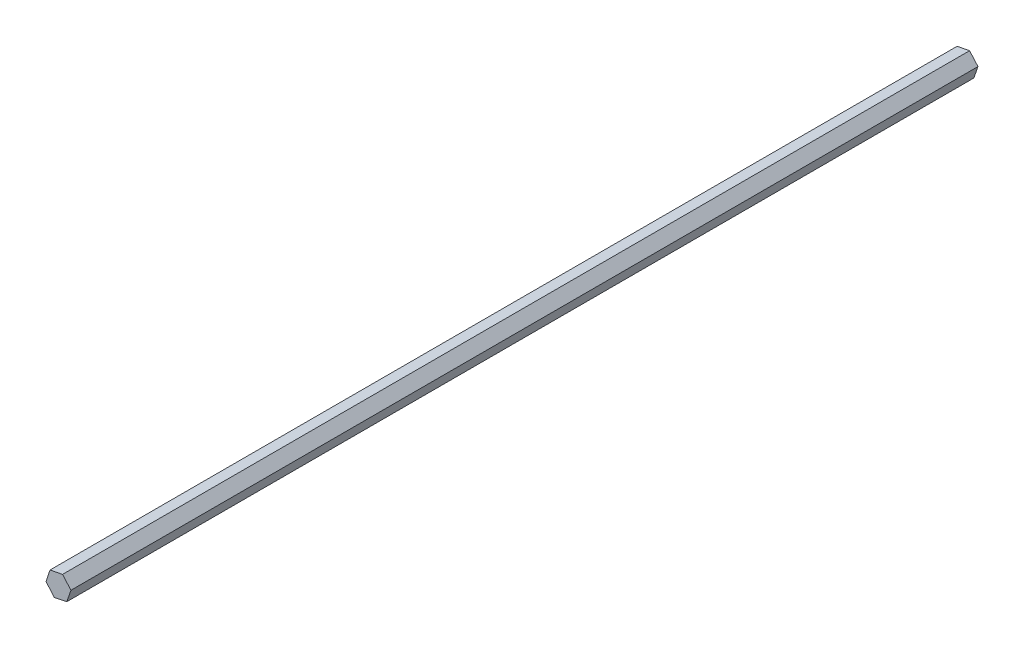
ISO-10303-21;
HEADER;
FILE_DESCRIPTION(('STEP AP214'),'2;1');
FILE_NAME('part.step','',(''),(''),'','','');
FILE_SCHEMA(('AUTOMOTIVE_DESIGN { 1 0 10303 214 1 1 1 1 }'));
ENDSEC;
DATA;
#1=APPLICATION_CONTEXT('core data for automotive mechanical design processes');
#2=APPLICATION_PROTOCOL_DEFINITION('international standard','automotive_design',2000,#1);
#3=PRODUCT_CONTEXT('',#1,'mechanical');
#4=PRODUCT('Part','Part','',(#3));
#5=PRODUCT_RELATED_PRODUCT_CATEGORY('part','',(#4));
#6=PRODUCT_DEFINITION_FORMATION('','',#4);
#7=PRODUCT_DEFINITION_CONTEXT('part definition',#1,'design');
#8=PRODUCT_DEFINITION('design','',#6,#7);
#9=PRODUCT_DEFINITION_SHAPE('','',#8);
#10=(LENGTH_UNIT() NAMED_UNIT(*) SI_UNIT(.MILLI.,.METRE.));
#11=(NAMED_UNIT(*) PLANE_ANGLE_UNIT() SI_UNIT($,.RADIAN.));
#12=(NAMED_UNIT(*) SI_UNIT($,.STERADIAN.) SOLID_ANGLE_UNIT());
#13=UNCERTAINTY_MEASURE_WITH_UNIT(LENGTH_MEASURE(1.E-05),#10,'distance_accuracy_value','');
#14=(GEOMETRIC_REPRESENTATION_CONTEXT(3) GLOBAL_UNCERTAINTY_ASSIGNED_CONTEXT((#13)) GLOBAL_UNIT_ASSIGNED_CONTEXT((#10,
#11,#12)) REPRESENTATION_CONTEXT('',''));
#15=CARTESIAN_POINT('',(0.,0.,0.));
#16=DIRECTION('',(0.,0.,1.));
#17=DIRECTION('',(1.,0.,0.));
#18=AXIS2_PLACEMENT_3D('',#15,#16,#17);
#19=CARTESIAN_POINT('',(-6.01957165055815,2.02169660033267,294.64));
#20=DIRECTION('',(-0.947964039457976,0.318377417375223,0.));
#21=DIRECTION('',(-0.318377417375223,-0.947964039457976,0.));
#22=AXIS2_PLACEMENT_3D('',#19,#20,#21);
#23=PLANE('',#22);
#24=DIRECTION('',(0.318377417375223,0.947964039457976,0.));
#25=VECTOR('',#24,1.);
#26=CARTESIAN_POINT('',(-6.01957165055815,2.02169660033267,-228.6));
#27=LINE('',#26,#25);
#28=CARTESIAN_POINT('',(-7.17571857524597,-1.42071372502755,-228.6));
#29=VERTEX_POINT('',#28);
#30=CARTESIAN_POINT('',(-4.84121158124874,5.53024623443575,-228.6));
#31=VERTEX_POINT('',#30);
#32=EDGE_CURVE('E119',#29,#31,#27,.T.);
#33=ORIENTED_EDGE('',*,*,#32,.F.);
#34=DIRECTION('',(0.,0.,-1.));
#35=VECTOR('',#34,1.);
#36=CARTESIAN_POINT('',(-7.17571857524597,-1.42071372502755,294.64));
#37=LINE('',#36,#35);
#38=CARTESIAN_POINT('',(-7.17571857524597,-1.42071372502755,294.64));
#39=VERTEX_POINT('',#38);
#40=EDGE_CURVE('E11',#39,#29,#37,.T.);
#41=ORIENTED_EDGE('',*,*,#40,.F.);
#42=DIRECTION('',(0.318377417375223,0.947964039457976,0.));
#43=VECTOR('',#42,1.);
#44=CARTESIAN_POINT('',(-6.01957165055815,2.02169660033267,294.64));
#45=LINE('',#44,#43);
#46=CARTESIAN_POINT('',(-4.84121158124874,5.53024623443575,294.64));
#47=VERTEX_POINT('',#46);
#48=EDGE_CURVE('E133',#39,#47,#45,.T.);
#49=ORIENTED_EDGE('',*,*,#48,.T.);
#50=DIRECTION('',(0.,0.,-1.));
#51=VECTOR('',#50,1.);
#52=CARTESIAN_POINT('',(-4.84121158124874,5.53024623443575,294.64));
#53=LINE('',#52,#51);
#54=EDGE_CURVE('E37',#47,#31,#53,.T.);
#55=ORIENTED_EDGE('',*,*,#54,.T.);
#56=EDGE_LOOP('',(#33,#41,#49,#55));
#57=FACE_BOUND('',#56,.T.);
#58=ADVANCED_FACE('F34',(#57),#23,.T.);
#59=CARTESIAN_POINT('',(-4.79509283412342,-4.16288177974564,294.64));
#60=DIRECTION('',(-0.755132729783216,-0.655571933818211,0.));
#61=DIRECTION('',(0.655571933818211,-0.755132729783216,0.));
#62=AXIS2_PLACEMENT_3D('',#59,#60,#61);
#63=PLANE('',#62);
#64=DIRECTION('',(-0.655571933818211,0.755132729783216,0.));
#65=VECTOR('',#64,1.);
#66=CARTESIAN_POINT('',(-4.79509283412342,-4.16288177974564,-228.6));
#67=LINE('',#66,#65);
#68=CARTESIAN_POINT('',(-2.36872793758021,-6.95773533167472,-228.6));
#69=VERTEX_POINT('',#68);
#70=EDGE_CURVE('E131',#69,#29,#67,.T.);
#71=ORIENTED_EDGE('',*,*,#70,.F.);
#72=DIRECTION('',(0.,0.,-1.));
#73=VECTOR('',#72,1.);
#74=CARTESIAN_POINT('',(-2.36872793758021,-6.95773533167472,294.64));
#75=LINE('',#74,#73);
#76=CARTESIAN_POINT('',(-2.36872793758021,-6.95773533167472,294.64));
#77=VERTEX_POINT('',#76);
#78=EDGE_CURVE('E43',#77,#69,#75,.T.);
#79=ORIENTED_EDGE('',*,*,#78,.F.);
#80=DIRECTION('',(-0.655571933818211,0.755132729783216,0.));
#81=VECTOR('',#80,1.);
#82=CARTESIAN_POINT('',(-4.79509283412342,-4.16288177974564,294.64));
#83=LINE('',#82,#81);
#84=EDGE_CURVE('E109',#77,#39,#83,.T.);
#85=ORIENTED_EDGE('',*,*,#84,.T.);
#86=ORIENTED_EDGE('',*,*,#40,.T.);
#87=EDGE_LOOP('',(#71,#79,#85,#86));
#88=FACE_BOUND('',#87,.T.);
#89=ADVANCED_FACE('F141',(#88),#63,.T.);
#90=CARTESIAN_POINT('',(1.25894521064635,-6.22395026945031,294.64));
#91=DIRECTION('',(0.198259088290764,-0.980149648732333,0.));
#92=DIRECTION('',(0.980149648732333,0.198259088290764,0.));
#93=AXIS2_PLACEMENT_3D('',#90,#91,#92);
#94=PLANE('',#93);
#95=DIRECTION('',(-0.980149648732333,-0.198259088290764,0.));
#96=VECTOR('',#95,1.);
#97=CARTESIAN_POINT('',(1.25894521064635,-6.22395026945031,-228.6));
#98=LINE('',#97,#96);
#99=CARTESIAN_POINT('',(4.81823346500206,-5.50399771405711,-228.6));
#100=VERTEX_POINT('',#99);
#101=EDGE_CURVE('E96',#100,#69,#98,.T.);
#102=ORIENTED_EDGE('',*,*,#101,.F.);
#103=DIRECTION('',(0.,0.,-1.));
#104=VECTOR('',#103,1.);
#105=CARTESIAN_POINT('',(4.81823346500206,-5.50399771405711,294.64));
#106=LINE('',#105,#104);
#107=CARTESIAN_POINT('',(4.81823346500206,-5.50399771405711,294.64));
#108=VERTEX_POINT('',#107);
#109=EDGE_CURVE('E91',#108,#100,#106,.T.);
#110=ORIENTED_EDGE('',*,*,#109,.F.);
#111=DIRECTION('',(-0.980149648732333,-0.198259088290764,0.));
#112=VECTOR('',#111,1.);
#113=CARTESIAN_POINT('',(1.25894521064635,-6.22395026945031,294.64));
#114=LINE('',#113,#112);
#115=EDGE_CURVE('E94',#108,#77,#114,.T.);
#116=ORIENTED_EDGE('',*,*,#115,.T.);
#117=ORIENTED_EDGE('',*,*,#78,.T.);
#118=EDGE_LOOP('',(#102,#110,#116,#117));
#119=FACE_BOUND('',#118,.T.);
#120=ADVANCED_FACE('F93',(#119),#94,.T.);
#121=CARTESIAN_POINT('',(6.00270779127281,-2.07123131798279,294.64));
#122=DIRECTION('',(0.945308313586269,-0.32617816031225,0.));
#123=DIRECTION('',(0.32617816031225,0.945308313586269,0.));
#124=AXIS2_PLACEMENT_3D('',#121,#122,#123);
#125=PLANE('',#124);
#126=DIRECTION('',(-0.32617816031225,-0.945308313586269,0.));
#127=VECTOR('',#126,1.);
#128=CARTESIAN_POINT('',(6.00270779127281,-2.07123131798279,-228.6));
#129=LINE('',#128,#127);
#130=CARTESIAN_POINT('',(7.20993951882896,1.42748909723898,-228.6));
#131=VERTEX_POINT('',#130);
#132=EDGE_CURVE('E128',#131,#100,#129,.T.);
#133=ORIENTED_EDGE('',*,*,#132,.F.);
#134=DIRECTION('',(0.,0.,-1.));
#135=VECTOR('',#134,1.);
#136=CARTESIAN_POINT('',(7.20993951882896,1.42748909723898,294.64));
#137=LINE('',#136,#135);
#138=CARTESIAN_POINT('',(7.20993951882896,1.42748909723898,294.64));
#139=VERTEX_POINT('',#138);
#140=EDGE_CURVE('E101',#139,#131,#137,.T.);
#141=ORIENTED_EDGE('',*,*,#140,.F.);
#142=DIRECTION('',(-0.32617816031225,-0.945308313586269,0.));
#143=VECTOR('',#142,1.);
#144=CARTESIAN_POINT('',(6.00270779127281,-2.07123131798279,294.64));
#145=LINE('',#144,#143);
#146=EDGE_CURVE('E107',#139,#108,#145,.T.);
#147=ORIENTED_EDGE('',*,*,#146,.T.);
#148=ORIENTED_EDGE('',*,*,#109,.T.);
#149=EDGE_LOOP('',(#133,#141,#147,#148));
#150=FACE_BOUND('',#149,.T.);
#151=ADVANCED_FACE('F111',(#150),#125,.T.);
#152=CARTESIAN_POINT('',(4.7606264399118,4.20225366911765,294.64));
#153=DIRECTION('',(0.749704951167212,0.66177223135711,0.));
#154=DIRECTION('',(-0.66177223135711,0.749704951167212,0.));
#155=AXIS2_PLACEMENT_3D('',#152,#153,#154);
#156=PLANE('',#155);
#157=DIRECTION('',(0.66177223135711,-0.749704951167212,0.));
#158=VECTOR('',#157,1.);
#159=CARTESIAN_POINT('',(4.7606264399118,4.20225366911765,-228.6));
#160=LINE('',#159,#158);
#161=CARTESIAN_POINT('',(2.35748511024392,6.92471143908466,-228.6));
#162=VERTEX_POINT('',#161);
#163=EDGE_CURVE('E125',#162,#131,#160,.T.);
#164=ORIENTED_EDGE('',*,*,#163,.F.);
#165=DIRECTION('',(0.,0.,-1.));
#166=VECTOR('',#165,1.);
#167=CARTESIAN_POINT('',(2.35748511024392,6.92471143908466,294.64));
#168=LINE('',#167,#166);
#169=CARTESIAN_POINT('',(2.35748511024392,6.92471143908466,294.64));
#170=VERTEX_POINT('',#169);
#171=EDGE_CURVE('E136',#170,#162,#168,.T.);
#172=ORIENTED_EDGE('',*,*,#171,.F.);
#173=DIRECTION('',(0.66177223135711,-0.749704951167212,0.));
#174=VECTOR('',#173,1.);
#175=CARTESIAN_POINT('',(4.7606264399118,4.20225366911765,294.64));
#176=LINE('',#175,#174);
#177=EDGE_CURVE('E112',#170,#139,#176,.T.);
#178=ORIENTED_EDGE('',*,*,#177,.T.);
#179=ORIENTED_EDGE('',*,*,#140,.T.);
#180=EDGE_LOOP('',(#164,#172,#178,#179));
#181=FACE_BOUND('',#180,.T.);
#182=ADVANCED_FACE('F154',(#181),#156,.T.);
#183=CARTESIAN_POINT('',(-1.20761495714939,6.23411309772842,294.64));
#184=DIRECTION('',(-0.190175583803053,0.981750094130461,0.));
#185=DIRECTION('',(-0.981750094130461,-0.190175583803053,0.));
#186=AXIS2_PLACEMENT_3D('',#183,#184,#185);
#187=PLANE('',#186);
#188=DIRECTION('',(0.981750094130461,0.190175583803053,0.));
#189=VECTOR('',#188,1.);
#190=CARTESIAN_POINT('',(-1.20761495714939,6.23411309772842,-228.6));
#191=LINE('',#190,#189);
#192=EDGE_CURVE('E122',#31,#162,#191,.T.);
#193=ORIENTED_EDGE('',*,*,#192,.F.);
#194=ORIENTED_EDGE('',*,*,#54,.F.);
#195=DIRECTION('',(0.981750094130461,0.190175583803053,0.));
#196=VECTOR('',#195,1.);
#197=CARTESIAN_POINT('',(-1.20761495714939,6.23411309772842,294.64));
#198=LINE('',#197,#196);
#199=EDGE_CURVE('E114',#47,#170,#198,.T.);
#200=ORIENTED_EDGE('',*,*,#199,.T.);
#201=ORIENTED_EDGE('',*,*,#171,.T.);
#202=EDGE_LOOP('',(#193,#194,#200,#201));
#203=FACE_BOUND('',#202,.T.);
#204=ADVANCED_FACE('F138',(#203),#187,.T.);
#205=CARTESIAN_POINT('',(0.,0.,294.64));
#206=DIRECTION('',(0.,0.,-1.));
#207=DIRECTION('',(-1.,0.,0.));
#208=AXIS2_PLACEMENT_3D('',#205,#206,#207);
#209=PLANE('',#208);
#210=ORIENTED_EDGE('',*,*,#48,.F.);
#211=ORIENTED_EDGE('',*,*,#84,.F.);
#212=ORIENTED_EDGE('',*,*,#115,.F.);
#213=ORIENTED_EDGE('',*,*,#146,.F.);
#214=ORIENTED_EDGE('',*,*,#177,.F.);
#215=ORIENTED_EDGE('',*,*,#199,.F.);
#216=EDGE_LOOP('',(#210,#211,#212,#213,#214,#215));
#217=FACE_BOUND('',#216,.T.);
#218=ADVANCED_FACE('F105',(#217),#209,.F.);
#219=CARTESIAN_POINT('',(0.,0.,-228.6));
#220=DIRECTION('',(0.,0.,-1.));
#221=DIRECTION('',(-1.,0.,0.));
#222=AXIS2_PLACEMENT_3D('',#219,#220,#221);
#223=PLANE('',#222);
#224=ORIENTED_EDGE('',*,*,#32,.T.);
#225=ORIENTED_EDGE('',*,*,#192,.T.);
#226=ORIENTED_EDGE('',*,*,#163,.T.);
#227=ORIENTED_EDGE('',*,*,#132,.T.);
#228=ORIENTED_EDGE('',*,*,#101,.T.);
#229=ORIENTED_EDGE('',*,*,#70,.T.);
#230=EDGE_LOOP('',(#224,#225,#226,#227,#228,#229));
#231=FACE_BOUND('',#230,.T.);
#232=ADVANCED_FACE('F140',(#231),#223,.T.);
#233=CLOSED_SHELL('',(#58,#89,#120,#151,#182,#204,#218,#232));
#234=MANIFOLD_SOLID_BREP('B2',#233);
#235=ADVANCED_BREP_SHAPE_REPRESENTATION('',(#18,#234),#14);
#236=SHAPE_DEFINITION_REPRESENTATION(#9,#235);
ENDSEC;
END-ISO-10303-21;
